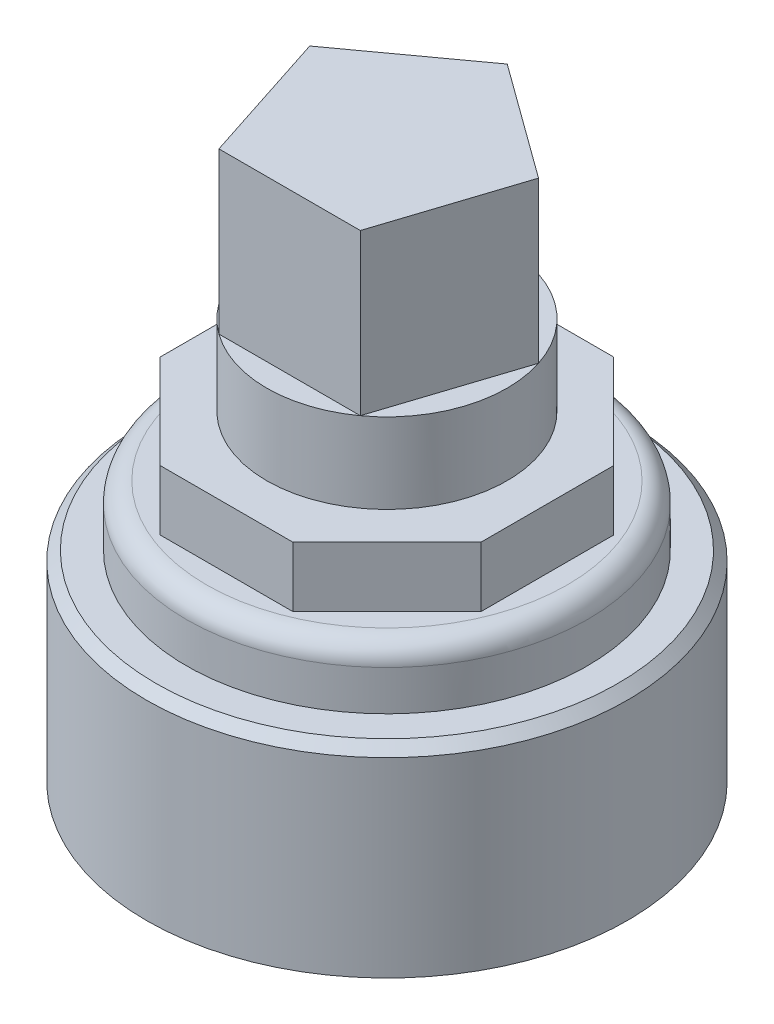
ISO-10303-21;
HEADER;
FILE_DESCRIPTION(('STEP AP214'),'2;1');
FILE_NAME('part.step','',(''),(''),'','','');
FILE_SCHEMA(('AUTOMOTIVE_DESIGN { 1 0 10303 214 1 1 1 1 }'));
ENDSEC;
DATA;
#1=APPLICATION_CONTEXT('core data for automotive mechanical design processes');
#2=APPLICATION_PROTOCOL_DEFINITION('international standard','automotive_design',2000,#1);
#3=PRODUCT_CONTEXT('',#1,'mechanical');
#4=PRODUCT('Part','Part','',(#3));
#5=PRODUCT_RELATED_PRODUCT_CATEGORY('part','',(#4));
#6=PRODUCT_DEFINITION_FORMATION('','',#4);
#7=PRODUCT_DEFINITION_CONTEXT('part definition',#1,'design');
#8=PRODUCT_DEFINITION('design','',#6,#7);
#9=PRODUCT_DEFINITION_SHAPE('','',#8);
#10=(LENGTH_UNIT() NAMED_UNIT(*) SI_UNIT(.MILLI.,.METRE.));
#11=(NAMED_UNIT(*) PLANE_ANGLE_UNIT() SI_UNIT($,.RADIAN.));
#12=(NAMED_UNIT(*) SI_UNIT($,.STERADIAN.) SOLID_ANGLE_UNIT());
#13=UNCERTAINTY_MEASURE_WITH_UNIT(LENGTH_MEASURE(1.E-05),#10,'distance_accuracy_value','');
#14=(GEOMETRIC_REPRESENTATION_CONTEXT(3) GLOBAL_UNCERTAINTY_ASSIGNED_CONTEXT((#13)) GLOBAL_UNIT_ASSIGNED_CONTEXT((#10,
#11,#12)) REPRESENTATION_CONTEXT('',''));
#15=CARTESIAN_POINT('',(0.,0.,0.));
#16=DIRECTION('',(0.,0.,1.));
#17=DIRECTION('',(1.,0.,0.));
#18=AXIS2_PLACEMENT_3D('',#15,#16,#17);
#19=CARTESIAN_POINT('',(0.,63.5,0.));
#20=DIRECTION('',(0.,1.,0.));
#21=DIRECTION('',(0.,0.,1.));
#22=AXIS2_PLACEMENT_3D('',#19,#20,#21);
#23=PLANE('',#22);
#24=DIRECTION('',(-0.809016994374947,0.,0.587785252292473));
#25=VECTOR('',#24,1.);
#26=CARTESIAN_POINT('',(0.,63.5,-19.05));
#27=LINE('',#26,#25);
#28=CARTESIAN_POINT('',(0.,63.5,-19.05));
#29=VERTEX_POINT('',#28);
#30=CARTESIAN_POINT('',(-18.1176266354227,63.5,-5.88677374284274));
#31=VERTEX_POINT('',#30);
#32=EDGE_CURVE('E64',#29,#31,#27,.T.);
#33=ORIENTED_EDGE('',*,*,#32,.F.);
#34=CARTESIAN_POINT('',(0.,63.5,0.));
#35=DIRECTION('',(0.,1.,0.));
#36=DIRECTION('',(0.,0.,1.));
#37=AXIS2_PLACEMENT_3D('',#34,#35,#36);
#38=CIRCLE('',#37,19.05);
#39=EDGE_CURVE('E375',#29,#31,#38,.T.);
#40=ORIENTED_EDGE('',*,*,#39,.T.);
#41=EDGE_LOOP('',(#33,#40));
#42=FACE_BOUND('',#41,.T.);
#43=ADVANCED_FACE('F41',(#42),#23,.T.);
#44=DIRECTION('',(-0.809016994374948,0.,-0.587785252292473));
#45=VECTOR('',#44,1.);
#46=CARTESIAN_POINT('',(18.1176266354227,63.5,-5.88677374284276));
#47=LINE('',#46,#45);
#48=CARTESIAN_POINT('',(18.1176266354227,63.5,-5.88677374284274));
#49=VERTEX_POINT('',#48);
#50=EDGE_CURVE('E160',#49,#29,#47,.T.);
#51=ORIENTED_EDGE('',*,*,#50,.F.);
#52=EDGE_CURVE('E178',#49,#29,#38,.T.);
#53=ORIENTED_EDGE('',*,*,#52,.T.);
#54=EDGE_LOOP('',(#51,#53));
#55=FACE_BOUND('',#54,.T.);
#56=ADVANCED_FACE('F300',(#55),#23,.T.);
#57=DIRECTION('',(0.309016994374948,0.,-0.951056516295154));
#58=VECTOR('',#57,1.);
#59=CARTESIAN_POINT('',(11.1973090561716,63.5,15.4117737428427));
#60=LINE('',#59,#58);
#61=CARTESIAN_POINT('',(11.1973090561716,63.5,15.4117737428427));
#62=VERTEX_POINT('',#61);
#63=EDGE_CURVE('E338',#62,#49,#60,.T.);
#64=ORIENTED_EDGE('',*,*,#63,.F.);
#65=EDGE_CURVE('E171',#62,#49,#38,.T.);
#66=ORIENTED_EDGE('',*,*,#65,.T.);
#67=EDGE_LOOP('',(#64,#66));
#68=FACE_BOUND('',#67,.T.);
#69=ADVANCED_FACE('F306',(#68),#23,.T.);
#70=DIRECTION('',(1.,0.,0.));
#71=VECTOR('',#70,1.);
#72=CARTESIAN_POINT('',(-11.1973090561716,63.5,15.4117737428427));
#73=LINE('',#72,#71);
#74=CARTESIAN_POINT('',(-11.1973090561716,63.5,15.4117737428427));
#75=VERTEX_POINT('',#74);
#76=EDGE_CURVE('E331',#75,#62,#73,.T.);
#77=ORIENTED_EDGE('',*,*,#76,.F.);
#78=EDGE_CURVE('E164',#75,#62,#38,.T.);
#79=ORIENTED_EDGE('',*,*,#78,.T.);
#80=EDGE_LOOP('',(#77,#79));
#81=FACE_BOUND('',#80,.T.);
#82=ADVANCED_FACE('F312',(#81),#23,.T.);
#83=CARTESIAN_POINT('',(0.,41.275,0.));
#84=DIRECTION('',(0.,1.,0.));
#85=DIRECTION('',(0.,0.,1.));
#86=AXIS2_PLACEMENT_3D('',#83,#84,#85);
#87=PLANE('',#86);
#88=CARTESIAN_POINT('',(0.,41.275,0.));
#89=DIRECTION('',(0.,1.,0.));
#90=DIRECTION('',(0.,0.,1.));
#91=AXIS2_PLACEMENT_3D('',#88,#89,#90);
#92=CIRCLE('',#91,28.575);
#93=CARTESIAN_POINT('',(0.,41.275,28.575));
#94=VERTEX_POINT('',#93);
#95=EDGE_CURVE('E265',#94,#94,#92,.T.);
#96=ORIENTED_EDGE('',*,*,#95,.T.);
#97=EDGE_LOOP('',(#96));
#98=FACE_BOUND('',#97,.T.);
#99=DIRECTION('',(-0.707106781186548,0.,-0.707106781186547));
#100=VECTOR('',#99,1.);
#101=CARTESIAN_POINT('',(25.4,41.275,-10.5210244842766));
#102=LINE('',#101,#100);
#103=CARTESIAN_POINT('',(25.4,41.275,-10.5210244842766));
#104=VERTEX_POINT('',#103);
#105=CARTESIAN_POINT('',(10.5210244842766,41.275,-25.4));
#106=VERTEX_POINT('',#105);
#107=EDGE_CURVE('E210',#104,#106,#102,.T.);
#108=ORIENTED_EDGE('',*,*,#107,.F.);
#109=DIRECTION('',(0.,0.,-1.));
#110=VECTOR('',#109,1.);
#111=CARTESIAN_POINT('',(25.4,41.275,10.5210244842766));
#112=LINE('',#111,#110);
#113=CARTESIAN_POINT('',(25.4,41.275,10.5210244842766));
#114=VERTEX_POINT('',#113);
#115=EDGE_CURVE('E177',#114,#104,#112,.T.);
#116=ORIENTED_EDGE('',*,*,#115,.F.);
#117=DIRECTION('',(0.707106781186547,0.,-0.707106781186548));
#118=VECTOR('',#117,1.);
#119=CARTESIAN_POINT('',(10.5210244842766,41.275,25.4));
#120=LINE('',#119,#118);
#121=CARTESIAN_POINT('',(10.5210244842766,41.275,25.4));
#122=VERTEX_POINT('',#121);
#123=EDGE_CURVE('E185',#122,#114,#120,.T.);
#124=ORIENTED_EDGE('',*,*,#123,.F.);
#125=DIRECTION('',(1.,0.,0.));
#126=VECTOR('',#125,1.);
#127=CARTESIAN_POINT('',(-10.5210244842766,41.275,25.4));
#128=LINE('',#127,#126);
#129=CARTESIAN_POINT('',(-10.5210244842766,41.275,25.4));
#130=VERTEX_POINT('',#129);
#131=EDGE_CURVE('E225',#130,#122,#128,.T.);
#132=ORIENTED_EDGE('',*,*,#131,.F.);
#133=DIRECTION('',(0.707106781186548,0.,0.707106781186547));
#134=VECTOR('',#133,1.);
#135=CARTESIAN_POINT('',(-25.4,41.275,10.5210244842766));
#136=LINE('',#135,#134);
#137=CARTESIAN_POINT('',(-25.4,41.275,10.5210244842766));
#138=VERTEX_POINT('',#137);
#139=EDGE_CURVE('E222',#138,#130,#136,.T.);
#140=ORIENTED_EDGE('',*,*,#139,.F.);
#141=DIRECTION('',(0.,0.,1.));
#142=VECTOR('',#141,1.);
#143=CARTESIAN_POINT('',(-25.4,41.275,-10.5210244842766));
#144=LINE('',#143,#142);
#145=CARTESIAN_POINT('',(-25.4,41.275,-10.5210244842766));
#146=VERTEX_POINT('',#145);
#147=EDGE_CURVE('E219',#146,#138,#144,.T.);
#148=ORIENTED_EDGE('',*,*,#147,.F.);
#149=DIRECTION('',(-0.707106781186547,0.,0.707106781186548));
#150=VECTOR('',#149,1.);
#151=CARTESIAN_POINT('',(-10.5210244842766,41.275,-25.4));
#152=LINE('',#151,#150);
#153=CARTESIAN_POINT('',(-10.5210244842766,41.275,-25.4));
#154=VERTEX_POINT('',#153);
#155=EDGE_CURVE('E216',#154,#146,#152,.T.);
#156=ORIENTED_EDGE('',*,*,#155,.F.);
#157=DIRECTION('',(-1.,0.,0.));
#158=VECTOR('',#157,1.);
#159=CARTESIAN_POINT('',(10.5210244842766,41.275,-25.4));
#160=LINE('',#159,#158);
#161=EDGE_CURVE('E213',#106,#154,#160,.T.);
#162=ORIENTED_EDGE('',*,*,#161,.F.);
#163=EDGE_LOOP('',(#108,#116,#124,#132,#140,#148,#156,#162));
#164=FACE_BOUND('',#163,.T.);
#165=ADVANCED_FACE('F320',(#98,#164),#87,.T.);
#166=CARTESIAN_POINT('',(0.,31.75,0.));
#167=DIRECTION('',(0.,-1.,0.));
#168=DIRECTION('',(0.,0.,-1.));
#169=AXIS2_PLACEMENT_3D('',#166,#167,#168);
#170=CYLINDRICAL_SURFACE('',#169,38.1);
#171=CARTESIAN_POINT('',(0.,30.226,0.));
#172=DIRECTION('',(0.,1.,0.));
#173=DIRECTION('',(0.,0.,1.));
#174=AXIS2_PLACEMENT_3D('',#171,#172,#173);
#175=CIRCLE('',#174,38.1);
#176=CARTESIAN_POINT('',(0.,30.226,38.1));
#177=VERTEX_POINT('',#176);
#178=EDGE_CURVE('E266',#177,#177,#175,.F.);
#179=ORIENTED_EDGE('',*,*,#178,.T.);
#180=EDGE_LOOP('',(#179));
#181=FACE_BOUND('',#180,.T.);
#182=CARTESIAN_POINT('',(0.,0.,0.));
#183=DIRECTION('',(0.,1.,0.));
#184=DIRECTION('',(0.,0.,1.));
#185=AXIS2_PLACEMENT_3D('',#182,#183,#184);
#186=CIRCLE('',#185,38.1);
#187=CARTESIAN_POINT('',(0.,0.,38.1));
#188=VERTEX_POINT('',#187);
#189=EDGE_CURVE('E260',#188,#188,#186,.T.);
#190=ORIENTED_EDGE('',*,*,#189,.T.);
#191=EDGE_LOOP('',(#190));
#192=FACE_BOUND('',#191,.T.);
#193=ADVANCED_FACE('F326',(#181,#192),#170,.T.);
#194=CARTESIAN_POINT('',(0.,31.75,0.));
#195=DIRECTION('',(0.,1.,0.));
#196=DIRECTION('',(0.,0.,1.));
#197=AXIS2_PLACEMENT_3D('',#194,#195,#196);
#198=PLANE('',#197);
#199=CARTESIAN_POINT('',(0.,31.75,0.));
#200=DIRECTION('',(0.,1.,0.));
#201=DIRECTION('',(0.,0.,1.));
#202=AXIS2_PLACEMENT_3D('',#199,#200,#201);
#203=CIRCLE('',#202,31.75);
#204=CARTESIAN_POINT('',(0.,31.75,-31.75));
#205=VERTEX_POINT('',#204);
#206=EDGE_CURVE('E261',#205,#205,#203,.T.);
#207=ORIENTED_EDGE('',*,*,#206,.F.);
#208=EDGE_LOOP('',(#207));
#209=FACE_BOUND('',#208,.T.);
#210=CARTESIAN_POINT('',(0.,31.75,0.));
#211=DIRECTION('',(0.,1.,0.));
#212=DIRECTION('',(0.,0.,1.));
#213=AXIS2_PLACEMENT_3D('',#210,#211,#212);
#214=CIRCLE('',#213,36.576);
#215=CARTESIAN_POINT('',(0.,31.75,36.576));
#216=VERTEX_POINT('',#215);
#217=EDGE_CURVE('E270',#216,#216,#214,.T.);
#218=ORIENTED_EDGE('',*,*,#217,.T.);
#219=EDGE_LOOP('',(#218));
#220=FACE_BOUND('',#219,.T.);
#221=ADVANCED_FACE('F438',(#209,#220),#198,.T.);
#222=CARTESIAN_POINT('',(0.,0.,0.));
#223=DIRECTION('',(0.,1.,0.));
#224=DIRECTION('',(0.,0.,1.));
#225=AXIS2_PLACEMENT_3D('',#222,#223,#224);
#226=PLANE('',#225);
#227=ORIENTED_EDGE('',*,*,#189,.F.);
#228=EDGE_LOOP('',(#227));
#229=FACE_BOUND('',#228,.T.);
#230=ADVANCED_FACE('F441',(#229),#226,.F.);
#231=CARTESIAN_POINT('',(0.,31.75,0.));
#232=DIRECTION('',(0.,-1.,0.));
#233=DIRECTION('',(0.,0.,-1.));
#234=AXIS2_PLACEMENT_3D('',#231,#232,#233);
#235=CONICAL_SURFACE('',#234,36.576,0.785398163397448);
#236=ORIENTED_EDGE('',*,*,#178,.F.);
#237=EDGE_LOOP('',(#236));
#238=FACE_BOUND('',#237,.T.);
#239=ORIENTED_EDGE('',*,*,#217,.F.);
#240=EDGE_LOOP('',(#239));
#241=FACE_BOUND('',#240,.T.);
#242=ADVANCED_FACE('F297',(#238,#241),#235,.T.);
#243=CARTESIAN_POINT('',(0.,41.275,0.));
#244=DIRECTION('',(0.,-1.,0.));
#245=DIRECTION('',(0.,0.,-1.));
#246=AXIS2_PLACEMENT_3D('',#243,#244,#245);
#247=CYLINDRICAL_SURFACE('',#246,31.75);
#248=CARTESIAN_POINT('',(0.,38.1,0.));
#249=DIRECTION('',(0.,1.,0.));
#250=DIRECTION('',(0.,0.,1.));
#251=AXIS2_PLACEMENT_3D('',#248,#249,#250);
#252=CIRCLE('',#251,31.75);
#253=CARTESIAN_POINT('',(0.,38.1,-31.75));
#254=VERTEX_POINT('',#253);
#255=EDGE_CURVE('E45',#254,#254,#252,.F.);
#256=CARTESIAN_POINT('',(0.,38.1,-31.75));
#257=CARTESIAN_POINT('',(0.,38.0338541666667,-31.75));
#258=CARTESIAN_POINT('',(0.,37.9677083333333,-31.75));
#259=CARTESIAN_POINT('',(0.,37.8354166666667,-31.75));
#260=CARTESIAN_POINT('',(0.,37.7692708333333,-31.75));
#261=CARTESIAN_POINT('',(0.,37.6369791666667,-31.75));
#262=CARTESIAN_POINT('',(0.,37.5708333333333,-31.75));
#263=CARTESIAN_POINT('',(0.,37.4385416666667,-31.75));
#264=CARTESIAN_POINT('',(0.,37.3723958333333,-31.75));
#265=CARTESIAN_POINT('',(0.,37.2401041666667,-31.75));
#266=CARTESIAN_POINT('',(0.,37.1739583333333,-31.75));
#267=CARTESIAN_POINT('',(0.,37.0416666666667,-31.75));
#268=CARTESIAN_POINT('',(0.,36.9755208333333,-31.75));
#269=CARTESIAN_POINT('',(0.,36.8432291666667,-31.75));
#270=CARTESIAN_POINT('',(0.,36.7770833333333,-31.75));
#271=CARTESIAN_POINT('',(0.,36.6447916666667,-31.75));
#272=CARTESIAN_POINT('',(0.,36.5786458333333,-31.75));
#273=CARTESIAN_POINT('',(0.,36.4463541666667,-31.75));
#274=CARTESIAN_POINT('',(0.,36.3802083333333,-31.75));
#275=CARTESIAN_POINT('',(0.,36.2479166666667,-31.75));
#276=CARTESIAN_POINT('',(0.,36.1817708333333,-31.75));
#277=CARTESIAN_POINT('',(0.,36.0494791666667,-31.75));
#278=CARTESIAN_POINT('',(0.,35.9833333333333,-31.75));
#279=CARTESIAN_POINT('',(0.,35.8510416666667,-31.75));
#280=CARTESIAN_POINT('',(0.,35.7848958333333,-31.75));
#281=CARTESIAN_POINT('',(0.,35.6526041666667,-31.75));
#282=CARTESIAN_POINT('',(0.,35.5864583333333,-31.75));
#283=CARTESIAN_POINT('',(0.,35.4541666666667,-31.75));
#284=CARTESIAN_POINT('',(0.,35.3880208333333,-31.75));
#285=CARTESIAN_POINT('',(0.,35.2557291666667,-31.75));
#286=CARTESIAN_POINT('',(0.,35.1895833333333,-31.75));
#287=CARTESIAN_POINT('',(0.,35.0572916666667,-31.75));
#288=CARTESIAN_POINT('',(0.,34.9911458333333,-31.75));
#289=CARTESIAN_POINT('',(0.,34.8588541666667,-31.75));
#290=CARTESIAN_POINT('',(0.,34.7927083333333,-31.75));
#291=CARTESIAN_POINT('',(0.,34.6604166666667,-31.75));
#292=CARTESIAN_POINT('',(0.,34.5942708333333,-31.75));
#293=CARTESIAN_POINT('',(0.,34.4619791666667,-31.75));
#294=CARTESIAN_POINT('',(0.,34.3958333333333,-31.75));
#295=CARTESIAN_POINT('',(0.,34.2635416666667,-31.75));
#296=CARTESIAN_POINT('',(0.,34.1973958333333,-31.75));
#297=CARTESIAN_POINT('',(0.,34.0651041666667,-31.75));
#298=CARTESIAN_POINT('',(0.,33.9989583333333,-31.75));
#299=CARTESIAN_POINT('',(0.,33.8666666666667,-31.75));
#300=CARTESIAN_POINT('',(0.,33.8005208333333,-31.75));
#301=CARTESIAN_POINT('',(0.,33.6682291666667,-31.75));
#302=CARTESIAN_POINT('',(0.,33.6020833333333,-31.75));
#303=CARTESIAN_POINT('',(0.,33.4697916666667,-31.75));
#304=CARTESIAN_POINT('',(0.,33.4036458333333,-31.75));
#305=CARTESIAN_POINT('',(0.,33.2713541666667,-31.75));
#306=CARTESIAN_POINT('',(0.,33.2052083333333,-31.75));
#307=CARTESIAN_POINT('',(0.,33.0729166666667,-31.75));
#308=CARTESIAN_POINT('',(0.,33.0067708333333,-31.75));
#309=CARTESIAN_POINT('',(0.,32.8744791666667,-31.75));
#310=CARTESIAN_POINT('',(0.,32.8083333333333,-31.75));
#311=CARTESIAN_POINT('',(0.,32.6760416666667,-31.75));
#312=CARTESIAN_POINT('',(0.,32.6098958333333,-31.75));
#313=CARTESIAN_POINT('',(0.,32.4776041666667,-31.75));
#314=CARTESIAN_POINT('',(0.,32.4114583333333,-31.75));
#315=CARTESIAN_POINT('',(0.,32.2791666666667,-31.75));
#316=CARTESIAN_POINT('',(0.,32.2130208333333,-31.75));
#317=CARTESIAN_POINT('',(0.,32.0807291666667,-31.75));
#318=CARTESIAN_POINT('',(0.,32.0145833333333,-31.75));
#319=CARTESIAN_POINT('',(0.,31.8822916666667,-31.75));
#320=CARTESIAN_POINT('',(0.,31.8161458333333,-31.75));
#321=CARTESIAN_POINT('',(0.,31.75,-31.75));
#322=B_SPLINE_CURVE_WITH_KNOTS('',3,(#256,#257,#258,#259,#260,#261,#262,#263,#264,#265,#266,
#267,#268,#269,#270,#271,#272,#273,#274,#275,#276,#277,#278,#279,#280,#281,#282,#283,#284,#285,
#286,#287,#288,#289,#290,#291,#292,#293,#294,#295,#296,#297,#298,#299,#300,#301,#302,#303,#304,
#305,#306,#307,#308,#309,#310,#311,#312,#313,#314,#315,#316,#317,#318,#319,#320,#321),
.UNSPECIFIED.,.F.,.F.,(4,2,2,2,2,2,2,2,2,2,2,2,2,2,2,2,2,2,2,2,2,2,2,2,2,2,2,2,2,2,2,2,4),(0.,
0.198437500000002,0.396875000000005,0.5953125,0.793750000000003,0.992187500000005,1.190625,
1.3890625,1.58750000000001,1.7859375,1.984375,2.18281250000001,2.38125,2.5796875,
2.77812500000001,2.9765625,3.175,3.37343750000001,3.57187500000001,3.7703125,3.96875000000001,
4.16718750000001,4.365625,4.56406250000001,4.7625,4.96093750000001,5.15937500000001,5.3578125,
5.55625000000001,5.75468750000001,5.953125,6.15156250000001,6.35000000000001),.UNSPECIFIED.);
#323=EDGE_CURVE('BSEAM284',#254,#205,#322,.T.);
#324=ORIENTED_EDGE('',*,*,#255,.T.);
#325=ORIENTED_EDGE('',*,*,#206,.T.);
#326=ORIENTED_EDGE('',*,*,#323,.T.);
#327=ORIENTED_EDGE('',*,*,#323,.F.);
#328=EDGE_LOOP('',(#324,#326,#325,#327));
#329=FACE_BOUND('',#328,.T.);
#330=ADVANCED_FACE('F284',(#329),#247,.T.);
#331=CARTESIAN_POINT('',(0.,38.1,0.));
#332=DIRECTION('',(0.,1.,0.));
#333=DIRECTION('',(0.,0.,1.));
#334=AXIS2_PLACEMENT_3D('',#331,#332,#333);
#335=TOROIDAL_SURFACE('',#334,28.575,3.175);
#336=ORIENTED_EDGE('',*,*,#255,.F.);
#337=EDGE_LOOP('',(#336));
#338=FACE_BOUND('',#337,.T.);
#339=ORIENTED_EDGE('',*,*,#95,.F.);
#340=EDGE_LOOP('',(#339));
#341=FACE_BOUND('',#340,.T.);
#342=ADVANCED_FACE('F43',(#338,#341),#335,.T.);
#343=CARTESIAN_POINT('',(25.4,50.8,10.5210244842766));
#344=DIRECTION('',(-1.,0.,0.));
#345=DIRECTION('',(0.,0.,1.));
#346=AXIS2_PLACEMENT_3D('',#343,#344,#345);
#347=PLANE('',#346);
#348=ORIENTED_EDGE('',*,*,#115,.T.);
#349=DIRECTION('',(0.,-1.,0.));
#350=VECTOR('',#349,1.);
#351=CARTESIAN_POINT('',(25.4,50.8,-10.5210244842766));
#352=LINE('',#351,#350);
#353=CARTESIAN_POINT('',(25.4,50.8,-10.5210244842766));
#354=VERTEX_POINT('',#353);
#355=EDGE_CURVE('E257',#354,#104,#352,.T.);
#356=ORIENTED_EDGE('',*,*,#355,.F.);
#357=DIRECTION('',(0.,0.,-1.));
#358=VECTOR('',#357,1.);
#359=CARTESIAN_POINT('',(25.4,50.8,10.5210244842766));
#360=LINE('',#359,#358);
#361=CARTESIAN_POINT('',(25.4,50.8,10.5210244842766));
#362=VERTEX_POINT('',#361);
#363=EDGE_CURVE('E180',#362,#354,#360,.T.);
#364=ORIENTED_EDGE('',*,*,#363,.F.);
#365=DIRECTION('',(0.,-1.,0.));
#366=VECTOR('',#365,1.);
#367=CARTESIAN_POINT('',(25.4,50.8,10.5210244842766));
#368=LINE('',#367,#366);
#369=EDGE_CURVE('E206',#362,#114,#368,.T.);
#370=ORIENTED_EDGE('',*,*,#369,.T.);
#371=EDGE_LOOP('',(#348,#356,#364,#370));
#372=FACE_BOUND('',#371,.T.);
#373=ADVANCED_FACE('F289',(#372),#347,.F.);
#374=CARTESIAN_POINT('',(25.4,50.8,-10.5210244842766));
#375=DIRECTION('',(-0.707106781186547,0.,0.707106781186548));
#376=DIRECTION('',(0.707106781186548,0.,0.707106781186547));
#377=AXIS2_PLACEMENT_3D('',#374,#375,#376);
#378=PLANE('',#377);
#379=ORIENTED_EDGE('',*,*,#107,.T.);
#380=DIRECTION('',(0.,-1.,0.));
#381=VECTOR('',#380,1.);
#382=CARTESIAN_POINT('',(10.5210244842766,50.8,-25.4));
#383=LINE('',#382,#381);
#384=CARTESIAN_POINT('',(10.5210244842766,50.8,-25.4));
#385=VERTEX_POINT('',#384);
#386=EDGE_CURVE('E253',#385,#106,#383,.T.);
#387=ORIENTED_EDGE('',*,*,#386,.F.);
#388=DIRECTION('',(-0.707106781186548,0.,-0.707106781186547));
#389=VECTOR('',#388,1.);
#390=CARTESIAN_POINT('',(25.4,50.8,-10.5210244842766));
#391=LINE('',#390,#389);
#392=EDGE_CURVE('E184',#354,#385,#391,.T.);
#393=ORIENTED_EDGE('',*,*,#392,.F.);
#394=ORIENTED_EDGE('',*,*,#355,.T.);
#395=EDGE_LOOP('',(#379,#387,#393,#394));
#396=FACE_BOUND('',#395,.T.);
#397=ADVANCED_FACE('F294',(#396),#378,.F.);
#398=CARTESIAN_POINT('',(10.5210244842766,50.8,-25.4));
#399=DIRECTION('',(0.,0.,1.));
#400=DIRECTION('',(1.,0.,0.));
#401=AXIS2_PLACEMENT_3D('',#398,#399,#400);
#402=PLANE('',#401);
#403=ORIENTED_EDGE('',*,*,#161,.T.);
#404=DIRECTION('',(0.,-1.,0.));
#405=VECTOR('',#404,1.);
#406=CARTESIAN_POINT('',(-10.5210244842766,50.8,-25.4));
#407=LINE('',#406,#405);
#408=CARTESIAN_POINT('',(-10.5210244842766,50.8,-25.4));
#409=VERTEX_POINT('',#408);
#410=EDGE_CURVE('E249',#409,#154,#407,.T.);
#411=ORIENTED_EDGE('',*,*,#410,.F.);
#412=DIRECTION('',(-1.,0.,0.));
#413=VECTOR('',#412,1.);
#414=CARTESIAN_POINT('',(10.5210244842766,50.8,-25.4));
#415=LINE('',#414,#413);
#416=EDGE_CURVE('E188',#385,#409,#415,.T.);
#417=ORIENTED_EDGE('',*,*,#416,.F.);
#418=ORIENTED_EDGE('',*,*,#386,.T.);
#419=EDGE_LOOP('',(#403,#411,#417,#418));
#420=FACE_BOUND('',#419,.T.);
#421=ADVANCED_FACE('F397',(#420),#402,.F.);
#422=CARTESIAN_POINT('',(-10.5210244842766,50.8,-25.4));
#423=DIRECTION('',(0.707106781186548,0.,0.707106781186547));
#424=DIRECTION('',(0.707106781186547,0.,-0.707106781186548));
#425=AXIS2_PLACEMENT_3D('',#422,#423,#424);
#426=PLANE('',#425);
#427=ORIENTED_EDGE('',*,*,#155,.T.);
#428=DIRECTION('',(0.,-1.,0.));
#429=VECTOR('',#428,1.);
#430=CARTESIAN_POINT('',(-25.4,50.8,-10.5210244842766));
#431=LINE('',#430,#429);
#432=CARTESIAN_POINT('',(-25.4,50.8,-10.5210244842766));
#433=VERTEX_POINT('',#432);
#434=EDGE_CURVE('E245',#433,#146,#431,.T.);
#435=ORIENTED_EDGE('',*,*,#434,.F.);
#436=DIRECTION('',(-0.707106781186547,0.,0.707106781186548));
#437=VECTOR('',#436,1.);
#438=CARTESIAN_POINT('',(-10.5210244842766,50.8,-25.4));
#439=LINE('',#438,#437);
#440=EDGE_CURVE('E191',#409,#433,#439,.T.);
#441=ORIENTED_EDGE('',*,*,#440,.F.);
#442=ORIENTED_EDGE('',*,*,#410,.T.);
#443=EDGE_LOOP('',(#427,#435,#441,#442));
#444=FACE_BOUND('',#443,.T.);
#445=ADVANCED_FACE('F403',(#444),#426,.F.);
#446=CARTESIAN_POINT('',(-25.4,50.8,-10.5210244842766));
#447=DIRECTION('',(1.,0.,0.));
#448=DIRECTION('',(0.,0.,-1.));
#449=AXIS2_PLACEMENT_3D('',#446,#447,#448);
#450=PLANE('',#449);
#451=ORIENTED_EDGE('',*,*,#147,.T.);
#452=DIRECTION('',(0.,-1.,0.));
#453=VECTOR('',#452,1.);
#454=CARTESIAN_POINT('',(-25.4,50.8,10.5210244842766));
#455=LINE('',#454,#453);
#456=CARTESIAN_POINT('',(-25.4,50.8,10.5210244842766));
#457=VERTEX_POINT('',#456);
#458=EDGE_CURVE('E241',#457,#138,#455,.T.);
#459=ORIENTED_EDGE('',*,*,#458,.F.);
#460=DIRECTION('',(0.,0.,1.));
#461=VECTOR('',#460,1.);
#462=CARTESIAN_POINT('',(-25.4,50.8,-10.5210244842766));
#463=LINE('',#462,#461);
#464=EDGE_CURVE('E194',#433,#457,#463,.T.);
#465=ORIENTED_EDGE('',*,*,#464,.F.);
#466=ORIENTED_EDGE('',*,*,#434,.T.);
#467=EDGE_LOOP('',(#451,#459,#465,#466));
#468=FACE_BOUND('',#467,.T.);
#469=ADVANCED_FACE('F407',(#468),#450,.F.);
#470=CARTESIAN_POINT('',(-25.4,50.8,10.5210244842766));
#471=DIRECTION('',(0.707106781186547,0.,-0.707106781186548));
#472=DIRECTION('',(-0.707106781186548,0.,-0.707106781186547));
#473=AXIS2_PLACEMENT_3D('',#470,#471,#472);
#474=PLANE('',#473);
#475=ORIENTED_EDGE('',*,*,#139,.T.);
#476=DIRECTION('',(0.,-1.,0.));
#477=VECTOR('',#476,1.);
#478=CARTESIAN_POINT('',(-10.5210244842766,50.8,25.4));
#479=LINE('',#478,#477);
#480=CARTESIAN_POINT('',(-10.5210244842766,50.8,25.4));
#481=VERTEX_POINT('',#480);
#482=EDGE_CURVE('E237',#481,#130,#479,.T.);
#483=ORIENTED_EDGE('',*,*,#482,.F.);
#484=DIRECTION('',(0.707106781186548,0.,0.707106781186547));
#485=VECTOR('',#484,1.);
#486=CARTESIAN_POINT('',(-25.4,50.8,10.5210244842766));
#487=LINE('',#486,#485);
#488=EDGE_CURVE('E197',#457,#481,#487,.T.);
#489=ORIENTED_EDGE('',*,*,#488,.F.);
#490=ORIENTED_EDGE('',*,*,#458,.T.);
#491=EDGE_LOOP('',(#475,#483,#489,#490));
#492=FACE_BOUND('',#491,.T.);
#493=ADVANCED_FACE('F412',(#492),#474,.F.);
#494=CARTESIAN_POINT('',(-10.5210244842766,50.8,25.4));
#495=DIRECTION('',(0.,0.,-1.));
#496=DIRECTION('',(-1.,0.,0.));
#497=AXIS2_PLACEMENT_3D('',#494,#495,#496);
#498=PLANE('',#497);
#499=ORIENTED_EDGE('',*,*,#131,.T.);
#500=DIRECTION('',(0.,-1.,0.));
#501=VECTOR('',#500,1.);
#502=CARTESIAN_POINT('',(10.5210244842766,50.8,25.4));
#503=LINE('',#502,#501);
#504=CARTESIAN_POINT('',(10.5210244842766,50.8,25.4));
#505=VERTEX_POINT('',#504);
#506=EDGE_CURVE('E234',#505,#122,#503,.T.);
#507=ORIENTED_EDGE('',*,*,#506,.F.);
#508=DIRECTION('',(1.,0.,0.));
#509=VECTOR('',#508,1.);
#510=CARTESIAN_POINT('',(-10.5210244842766,50.8,25.4));
#511=LINE('',#510,#509);
#512=EDGE_CURVE('E200',#481,#505,#511,.T.);
#513=ORIENTED_EDGE('',*,*,#512,.F.);
#514=ORIENTED_EDGE('',*,*,#482,.T.);
#515=EDGE_LOOP('',(#499,#507,#513,#514));
#516=FACE_BOUND('',#515,.T.);
#517=ADVANCED_FACE('F416',(#516),#498,.F.);
#518=CARTESIAN_POINT('',(10.5210244842766,50.8,25.4));
#519=DIRECTION('',(-0.707106781186548,0.,-0.707106781186547));
#520=DIRECTION('',(-0.707106781186547,0.,0.707106781186548));
#521=AXIS2_PLACEMENT_3D('',#518,#519,#520);
#522=PLANE('',#521);
#523=ORIENTED_EDGE('',*,*,#123,.T.);
#524=ORIENTED_EDGE('',*,*,#369,.F.);
#525=DIRECTION('',(0.707106781186547,0.,-0.707106781186548));
#526=VECTOR('',#525,1.);
#527=CARTESIAN_POINT('',(10.5210244842766,50.8,25.4));
#528=LINE('',#527,#526);
#529=EDGE_CURVE('E203',#505,#362,#528,.T.);
#530=ORIENTED_EDGE('',*,*,#529,.F.);
#531=ORIENTED_EDGE('',*,*,#506,.T.);
#532=EDGE_LOOP('',(#523,#524,#530,#531));
#533=FACE_BOUND('',#532,.T.);
#534=ADVANCED_FACE('F383',(#533),#522,.F.);
#535=CARTESIAN_POINT('',(0.,50.8,0.));
#536=DIRECTION('',(0.,1.,0.));
#537=DIRECTION('',(0.,0.,1.));
#538=AXIS2_PLACEMENT_3D('',#535,#536,#537);
#539=PLANE('',#538);
#540=CARTESIAN_POINT('',(0.,50.8,0.));
#541=DIRECTION('',(0.,1.,0.));
#542=DIRECTION('',(0.,0.,1.));
#543=AXIS2_PLACEMENT_3D('',#540,#541,#542);
#544=CIRCLE('',#543,19.05);
#545=CARTESIAN_POINT('',(0.,50.8,19.05));
#546=VERTEX_POINT('',#545);
#547=EDGE_CURVE('E11',#546,#546,#544,.T.);
#548=ORIENTED_EDGE('',*,*,#547,.F.);
#549=EDGE_LOOP('',(#548));
#550=FACE_BOUND('',#549,.T.);
#551=ORIENTED_EDGE('',*,*,#363,.T.);
#552=ORIENTED_EDGE('',*,*,#392,.T.);
#553=ORIENTED_EDGE('',*,*,#416,.T.);
#554=ORIENTED_EDGE('',*,*,#440,.T.);
#555=ORIENTED_EDGE('',*,*,#464,.T.);
#556=ORIENTED_EDGE('',*,*,#488,.T.);
#557=ORIENTED_EDGE('',*,*,#512,.T.);
#558=ORIENTED_EDGE('',*,*,#529,.T.);
#559=EDGE_LOOP('',(#551,#552,#553,#554,#555,#556,#557,#558));
#560=FACE_BOUND('',#559,.T.);
#561=ADVANCED_FACE('F317',(#550,#560),#539,.T.);
#562=CARTESIAN_POINT('',(0.,63.5,0.));
#563=DIRECTION('',(0.,-1.,0.));
#564=DIRECTION('',(0.,0.,-1.));
#565=AXIS2_PLACEMENT_3D('',#562,#563,#564);
#566=CYLINDRICAL_SURFACE('',#565,19.05);
#567=ORIENTED_EDGE('',*,*,#65,.F.);
#568=ORIENTED_EDGE('',*,*,#78,.F.);
#569=EDGE_CURVE('E169',#31,#75,#38,.T.);
#570=ORIENTED_EDGE('',*,*,#569,.F.);
#571=ORIENTED_EDGE('',*,*,#39,.F.);
#572=ORIENTED_EDGE('',*,*,#52,.F.);
#573=EDGE_LOOP('',(#567,#568,#570,#571,#572));
#574=FACE_BOUND('',#573,.T.);
#575=ORIENTED_EDGE('',*,*,#547,.T.);
#576=EDGE_LOOP('',(#575));
#577=FACE_BOUND('',#576,.T.);
#578=ADVANCED_FACE('F311',(#574,#577),#566,.T.);
#579=DIRECTION('',(0.309016994374948,0.,0.951056516295154));
#580=VECTOR('',#579,1.);
#581=CARTESIAN_POINT('',(-18.1176266354227,63.5,-5.88677374284275));
#582=LINE('',#581,#580);
#583=EDGE_CURVE('E57',#31,#75,#582,.T.);
#584=ORIENTED_EDGE('',*,*,#583,.F.);
#585=ORIENTED_EDGE('',*,*,#569,.T.);
#586=EDGE_LOOP('',(#584,#585));
#587=FACE_BOUND('',#586,.T.);
#588=ADVANCED_FACE('F302',(#587),#23,.T.);
#589=CARTESIAN_POINT('',(0.,88.9,-19.05));
#590=DIRECTION('',(0.587785252292473,0.,0.809016994374947));
#591=DIRECTION('',(0.809016994374947,0.,-0.587785252292473));
#592=AXIS2_PLACEMENT_3D('',#589,#590,#591);
#593=PLANE('',#592);
#594=ORIENTED_EDGE('',*,*,#32,.T.);
#595=DIRECTION('',(0.,-1.,0.));
#596=VECTOR('',#595,1.);
#597=CARTESIAN_POINT('',(-18.1176266354227,88.9,-5.88677374284275));
#598=LINE('',#597,#596);
#599=CARTESIAN_POINT('',(-18.1176266354227,88.9,-5.88677374284275));
#600=VERTEX_POINT('',#599);
#601=EDGE_CURVE('E143',#600,#31,#598,.T.);
#602=ORIENTED_EDGE('',*,*,#601,.F.);
#603=DIRECTION('',(-0.809016994374947,0.,0.587785252292473));
#604=VECTOR('',#603,1.);
#605=CARTESIAN_POINT('',(0.,88.9,-19.05));
#606=LINE('',#605,#604);
#607=CARTESIAN_POINT('',(0.,88.9,-19.05));
#608=VERTEX_POINT('',#607);
#609=EDGE_CURVE('E150',#608,#600,#606,.T.);
#610=ORIENTED_EDGE('',*,*,#609,.F.);
#611=DIRECTION('',(0.,-1.,0.));
#612=VECTOR('',#611,1.);
#613=CARTESIAN_POINT('',(0.,88.9,-19.05));
#614=LINE('',#613,#612);
#615=EDGE_CURVE('E352',#608,#29,#614,.T.);
#616=ORIENTED_EDGE('',*,*,#615,.T.);
#617=EDGE_LOOP('',(#594,#602,#610,#616));
#618=FACE_BOUND('',#617,.T.);
#619=ADVANCED_FACE('F162',(#618),#593,.F.);
#620=CARTESIAN_POINT('',(-18.1176266354227,88.9,-5.88677374284275));
#621=DIRECTION('',(0.951056516295154,0.,-0.309016994374948));
#622=DIRECTION('',(-0.309016994374948,0.,-0.951056516295154));
#623=AXIS2_PLACEMENT_3D('',#620,#621,#622);
#624=PLANE('',#623);
#625=ORIENTED_EDGE('',*,*,#583,.T.);
#626=DIRECTION('',(0.,-1.,0.));
#627=VECTOR('',#626,1.);
#628=CARTESIAN_POINT('',(-11.1973090561716,88.9,15.4117737428427));
#629=LINE('',#628,#627);
#630=CARTESIAN_POINT('',(-11.1973090561716,88.9,15.4117737428427));
#631=VERTEX_POINT('',#630);
#632=EDGE_CURVE('E145',#631,#75,#629,.T.);
#633=ORIENTED_EDGE('',*,*,#632,.F.);
#634=DIRECTION('',(0.309016994374948,0.,0.951056516295154));
#635=VECTOR('',#634,1.);
#636=CARTESIAN_POINT('',(-18.1176266354227,88.9,-5.88677374284275));
#637=LINE('',#636,#635);
#638=EDGE_CURVE('E139',#600,#631,#637,.T.);
#639=ORIENTED_EDGE('',*,*,#638,.F.);
#640=ORIENTED_EDGE('',*,*,#601,.T.);
#641=EDGE_LOOP('',(#625,#633,#639,#640));
#642=FACE_BOUND('',#641,.T.);
#643=ADVANCED_FACE('F141',(#642),#624,.F.);
#644=CARTESIAN_POINT('',(-11.1973090561716,88.9,15.4117737428427));
#645=DIRECTION('',(0.,0.,-1.));
#646=DIRECTION('',(-1.,0.,0.));
#647=AXIS2_PLACEMENT_3D('',#644,#645,#646);
#648=PLANE('',#647);
#649=ORIENTED_EDGE('',*,*,#76,.T.);
#650=DIRECTION('',(0.,-1.,0.));
#651=VECTOR('',#650,1.);
#652=CARTESIAN_POINT('',(11.1973090561716,88.9,15.4117737428427));
#653=LINE('',#652,#651);
#654=CARTESIAN_POINT('',(11.1973090561716,88.9,15.4117737428427));
#655=VERTEX_POINT('',#654);
#656=EDGE_CURVE('E172',#655,#62,#653,.T.);
#657=ORIENTED_EDGE('',*,*,#656,.F.);
#658=DIRECTION('',(1.,0.,0.));
#659=VECTOR('',#658,1.);
#660=CARTESIAN_POINT('',(-11.1973090561716,88.9,15.4117737428427));
#661=LINE('',#660,#659);
#662=EDGE_CURVE('E149',#631,#655,#661,.T.);
#663=ORIENTED_EDGE('',*,*,#662,.F.);
#664=ORIENTED_EDGE('',*,*,#632,.T.);
#665=EDGE_LOOP('',(#649,#657,#663,#664));
#666=FACE_BOUND('',#665,.T.);
#667=ADVANCED_FACE('F342',(#666),#648,.F.);
#668=CARTESIAN_POINT('',(11.1973090561716,88.9,15.4117737428427));
#669=DIRECTION('',(-0.951056516295154,0.,-0.309016994374947));
#670=DIRECTION('',(-0.309016994374948,0.,0.951056516295154));
#671=AXIS2_PLACEMENT_3D('',#668,#669,#670);
#672=PLANE('',#671);
#673=ORIENTED_EDGE('',*,*,#63,.T.);
#674=DIRECTION('',(0.,-1.,0.));
#675=VECTOR('',#674,1.);
#676=CARTESIAN_POINT('',(18.1176266354227,88.9,-5.88677374284276));
#677=LINE('',#676,#675);
#678=CARTESIAN_POINT('',(18.1176266354227,88.9,-5.88677374284276));
#679=VERTEX_POINT('',#678);
#680=EDGE_CURVE('E363',#679,#49,#677,.T.);
#681=ORIENTED_EDGE('',*,*,#680,.F.);
#682=DIRECTION('',(0.309016994374948,0.,-0.951056516295154));
#683=VECTOR('',#682,1.);
#684=CARTESIAN_POINT('',(11.1973090561716,88.9,15.4117737428427));
#685=LINE('',#684,#683);
#686=EDGE_CURVE('E345',#655,#679,#685,.T.);
#687=ORIENTED_EDGE('',*,*,#686,.F.);
#688=ORIENTED_EDGE('',*,*,#656,.T.);
#689=EDGE_LOOP('',(#673,#681,#687,#688));
#690=FACE_BOUND('',#689,.T.);
#691=ADVANCED_FACE('F368',(#690),#672,.F.);
#692=CARTESIAN_POINT('',(18.1176266354227,88.9,-5.88677374284276));
#693=DIRECTION('',(-0.587785252292473,0.,0.809016994374947));
#694=DIRECTION('',(0.809016994374948,0.,0.587785252292473));
#695=AXIS2_PLACEMENT_3D('',#692,#693,#694);
#696=PLANE('',#695);
#697=ORIENTED_EDGE('',*,*,#50,.T.);
#698=ORIENTED_EDGE('',*,*,#615,.F.);
#699=DIRECTION('',(-0.809016994374948,0.,-0.587785252292473));
#700=VECTOR('',#699,1.);
#701=CARTESIAN_POINT('',(18.1176266354227,88.9,-5.88677374284276));
#702=LINE('',#701,#700);
#703=EDGE_CURVE('E155',#679,#608,#702,.T.);
#704=ORIENTED_EDGE('',*,*,#703,.F.);
#705=ORIENTED_EDGE('',*,*,#680,.T.);
#706=EDGE_LOOP('',(#697,#698,#704,#705));
#707=FACE_BOUND('',#706,.T.);
#708=ADVANCED_FACE('F371',(#707),#696,.F.);
#709=CARTESIAN_POINT('',(0.,88.9,0.));
#710=DIRECTION('',(0.,1.,0.));
#711=DIRECTION('',(0.,0.,1.));
#712=AXIS2_PLACEMENT_3D('',#709,#710,#711);
#713=PLANE('',#712);
#714=ORIENTED_EDGE('',*,*,#609,.T.);
#715=ORIENTED_EDGE('',*,*,#638,.T.);
#716=ORIENTED_EDGE('',*,*,#662,.T.);
#717=ORIENTED_EDGE('',*,*,#686,.T.);
#718=ORIENTED_EDGE('',*,*,#703,.T.);
#719=EDGE_LOOP('',(#714,#715,#716,#717,#718));
#720=FACE_BOUND('',#719,.T.);
#721=ADVANCED_FACE('F153',(#720),#713,.T.);
#722=CLOSED_SHELL('',(#43,#56,#69,#82,#165,#193,#221,#230,#242,#330,#342,#373,#397,#421,#445,
#469,#493,#517,#534,#561,#578,#588,#619,#643,#667,#691,#708,#721));
#723=MANIFOLD_SOLID_BREP('B2',#722);
#724=ADVANCED_BREP_SHAPE_REPRESENTATION('',(#18,#723),#14);
#725=SHAPE_DEFINITION_REPRESENTATION(#9,#724);
ENDSEC;
END-ISO-10303-21;
